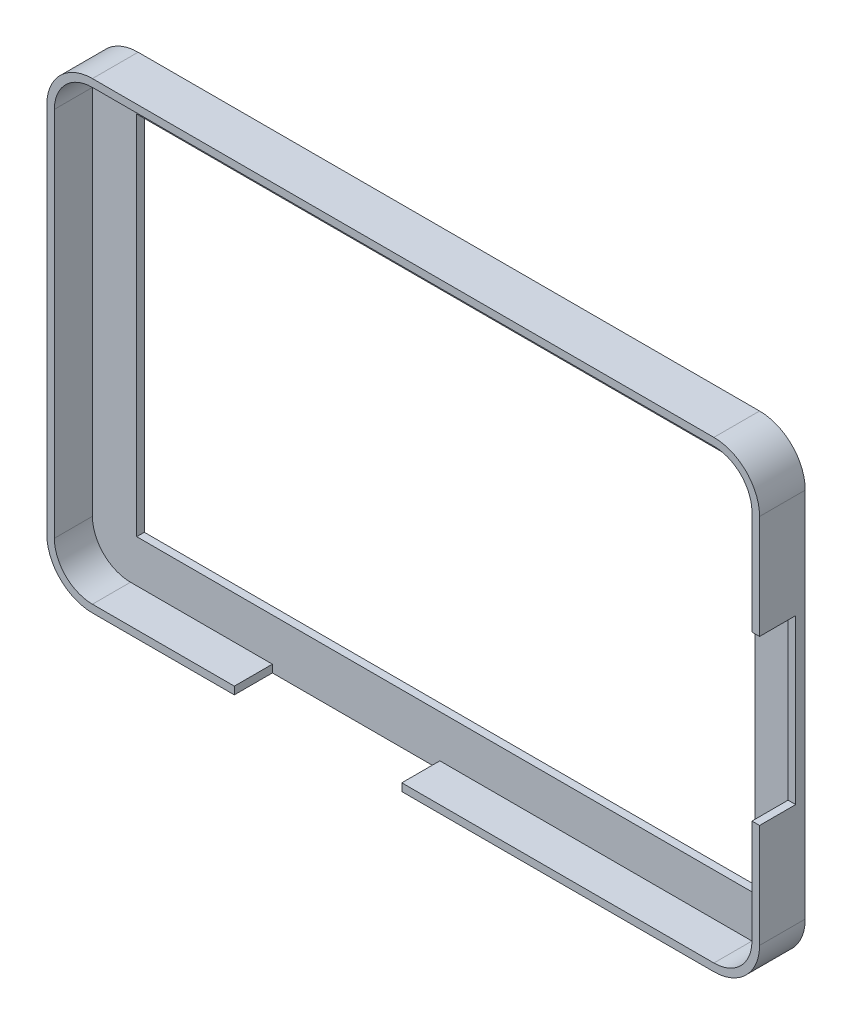
ISO-10303-21;
HEADER;
FILE_DESCRIPTION(('STEP AP214'),'2;1');
FILE_NAME('part.step','',(''),(''),'','','');
FILE_SCHEMA(('AUTOMOTIVE_DESIGN { 1 0 10303 214 1 1 1 1 }'));
ENDSEC;
DATA;
#1=APPLICATION_CONTEXT('core data for automotive mechanical design processes');
#2=APPLICATION_PROTOCOL_DEFINITION('international standard','automotive_design',2000,#1);
#3=PRODUCT_CONTEXT('',#1,'mechanical');
#4=PRODUCT('Part','Part','',(#3));
#5=PRODUCT_RELATED_PRODUCT_CATEGORY('part','',(#4));
#6=PRODUCT_DEFINITION_FORMATION('','',#4);
#7=PRODUCT_DEFINITION_CONTEXT('part definition',#1,'design');
#8=PRODUCT_DEFINITION('design','',#6,#7);
#9=PRODUCT_DEFINITION_SHAPE('','',#8);
#10=(LENGTH_UNIT() NAMED_UNIT(*) SI_UNIT(.MILLI.,.METRE.));
#11=(NAMED_UNIT(*) PLANE_ANGLE_UNIT() SI_UNIT($,.RADIAN.));
#12=(NAMED_UNIT(*) SI_UNIT($,.STERADIAN.) SOLID_ANGLE_UNIT());
#13=UNCERTAINTY_MEASURE_WITH_UNIT(LENGTH_MEASURE(1.E-05),#10,'distance_accuracy_value','');
#14=(GEOMETRIC_REPRESENTATION_CONTEXT(3) GLOBAL_UNCERTAINTY_ASSIGNED_CONTEXT((#13)) GLOBAL_UNIT_ASSIGNED_CONTEXT((#10,
#11,#12)) REPRESENTATION_CONTEXT('',''));
#15=CARTESIAN_POINT('',(0.,0.,0.));
#16=DIRECTION('',(0.,0.,1.));
#17=DIRECTION('',(1.,0.,0.));
#18=AXIS2_PLACEMENT_3D('',#15,#16,#17);
#19=CARTESIAN_POINT('',(46.82,-30.4,6.));
#20=DIRECTION('',(0.,1.,0.));
#21=DIRECTION('',(0.,0.,1.));
#22=AXIS2_PLACEMENT_3D('',#19,#20,#21);
#23=PLANE('',#22);
#24=DIRECTION('',(0.,0.,1.));
#25=VECTOR('',#24,1.);
#26=CARTESIAN_POINT('',(-0.18,-30.4,6.));
#27=LINE('',#26,#25);
#28=CARTESIAN_POINT('',(-0.18,-30.4,1.));
#29=VERTEX_POINT('',#28);
#30=CARTESIAN_POINT('',(-0.18,-30.4,6.));
#31=VERTEX_POINT('',#30);
#32=EDGE_CURVE('E247',#29,#31,#27,.T.);
#33=ORIENTED_EDGE('',*,*,#32,.F.);
#34=DIRECTION('',(1.,0.,0.));
#35=VECTOR('',#34,1.);
#36=CARTESIAN_POINT('',(-0.18,-30.4,1.));
#37=LINE('',#36,#35);
#38=CARTESIAN_POINT('',(-22.18,-30.4,0.999999999999997));
#39=VERTEX_POINT('',#38);
#40=EDGE_CURVE('E260',#39,#29,#37,.T.);
#41=ORIENTED_EDGE('',*,*,#40,.F.);
#42=DIRECTION('',(0.,0.,-1.));
#43=VECTOR('',#42,1.);
#44=CARTESIAN_POINT('',(-22.18,-30.4,6.));
#45=LINE('',#44,#43);
#46=CARTESIAN_POINT('',(-22.18,-30.4,6.));
#47=VERTEX_POINT('',#46);
#48=EDGE_CURVE('E255',#47,#39,#45,.T.);
#49=ORIENTED_EDGE('',*,*,#48,.F.);
#50=DIRECTION('',(1.,0.,0.));
#51=VECTOR('',#50,1.);
#52=CARTESIAN_POINT('',(46.82,-30.4,6.));
#53=LINE('',#52,#51);
#54=CARTESIAN_POINT('',(-40.82,-30.4,6.));
#55=VERTEX_POINT('',#54);
#56=EDGE_CURVE('E362',#55,#47,#53,.T.);
#57=ORIENTED_EDGE('',*,*,#56,.F.);
#58=DIRECTION('',(0.,0.,-1.));
#59=VECTOR('',#58,1.);
#60=CARTESIAN_POINT('',(-40.82,-30.4,6.));
#61=LINE('',#60,#59);
#62=CARTESIAN_POINT('',(-40.82,-30.4,0.));
#63=VERTEX_POINT('',#62);
#64=EDGE_CURVE('E394',#55,#63,#61,.T.);
#65=ORIENTED_EDGE('',*,*,#64,.T.);
#66=DIRECTION('',(1.,0.,0.));
#67=VECTOR('',#66,1.);
#68=CARTESIAN_POINT('',(46.82,-30.4,0.));
#69=LINE('',#68,#67);
#70=CARTESIAN_POINT('',(40.82,-30.4,0.));
#71=VERTEX_POINT('',#70);
#72=EDGE_CURVE('E374',#63,#71,#69,.T.);
#73=ORIENTED_EDGE('',*,*,#72,.T.);
#74=DIRECTION('',(0.,0.,-1.));
#75=VECTOR('',#74,1.);
#76=CARTESIAN_POINT('',(40.82,-30.4,6.));
#77=LINE('',#76,#75);
#78=CARTESIAN_POINT('',(40.82,-30.4,6.));
#79=VERTEX_POINT('',#78);
#80=EDGE_CURVE('E399',#71,#79,#77,.F.);
#81=ORIENTED_EDGE('',*,*,#80,.T.);
#82=EDGE_CURVE('E363',#31,#79,#53,.T.);
#83=ORIENTED_EDGE('',*,*,#82,.F.);
#84=EDGE_LOOP('',(#33,#41,#49,#57,#65,#73,#81,#83));
#85=FACE_BOUND('',#84,.T.);
#86=ADVANCED_FACE('F39',(#85),#23,.F.);
#87=CARTESIAN_POINT('',(0.,0.,6.));
#88=DIRECTION('',(0.,0.,-1.));
#89=DIRECTION('',(-1.,0.,0.));
#90=AXIS2_PLACEMENT_3D('',#87,#88,#89);
#91=PLANE('',#90);
#92=DIRECTION('',(0.,-1.,0.));
#93=VECTOR('',#92,1.);
#94=CARTESIAN_POINT('',(-22.18,-24.4,6.));
#95=LINE('',#94,#93);
#96=CARTESIAN_POINT('',(-22.18,-29.4,6.));
#97=VERTEX_POINT('',#96);
#98=EDGE_CURVE('E266',#97,#47,#95,.T.);
#99=ORIENTED_EDGE('',*,*,#98,.F.);
#100=DIRECTION('',(1.,0.,0.));
#101=VECTOR('',#100,1.);
#102=CARTESIAN_POINT('',(0.,-29.4,6.));
#103=LINE('',#102,#101);
#104=CARTESIAN_POINT('',(-40.82,-29.4,6.));
#105=VERTEX_POINT('',#104);
#106=EDGE_CURVE('E347',#105,#97,#103,.T.);
#107=ORIENTED_EDGE('',*,*,#106,.F.);
#108=CARTESIAN_POINT('',(-40.82,-24.4,6.));
#109=DIRECTION('',(0.,0.,-1.));
#110=DIRECTION('',(-1.,0.,0.));
#111=AXIS2_PLACEMENT_3D('',#108,#109,#110);
#112=CIRCLE('',#111,5.);
#113=CARTESIAN_POINT('',(-45.82,-24.4,6.));
#114=VERTEX_POINT('',#113);
#115=EDGE_CURVE('E341',#114,#105,#112,.F.);
#116=ORIENTED_EDGE('',*,*,#115,.F.);
#117=DIRECTION('',(0.,-1.,0.));
#118=VECTOR('',#117,1.);
#119=CARTESIAN_POINT('',(-45.82,0.,6.));
#120=LINE('',#119,#118);
#121=CARTESIAN_POINT('',(-45.82,24.4,6.));
#122=VERTEX_POINT('',#121);
#123=EDGE_CURVE('E338',#122,#114,#120,.T.);
#124=ORIENTED_EDGE('',*,*,#123,.F.);
#125=CARTESIAN_POINT('',(-40.82,24.4,6.));
#126=DIRECTION('',(0.,0.,-1.));
#127=DIRECTION('',(-1.,0.,0.));
#128=AXIS2_PLACEMENT_3D('',#125,#126,#127);
#129=CIRCLE('',#128,5.);
#130=CARTESIAN_POINT('',(-40.82,29.4,6.));
#131=VERTEX_POINT('',#130);
#132=EDGE_CURVE('E340',#131,#122,#129,.F.);
#133=ORIENTED_EDGE('',*,*,#132,.F.);
#134=DIRECTION('',(-1.,0.,0.));
#135=VECTOR('',#134,1.);
#136=CARTESIAN_POINT('',(0.,29.4,6.));
#137=LINE('',#136,#135);
#138=CARTESIAN_POINT('',(40.82,29.4,6.));
#139=VERTEX_POINT('',#138);
#140=EDGE_CURVE('E304',#139,#131,#137,.T.);
#141=ORIENTED_EDGE('',*,*,#140,.F.);
#142=CARTESIAN_POINT('',(40.82,24.4,6.));
#143=DIRECTION('',(0.,0.,-1.));
#144=DIRECTION('',(-1.,0.,0.));
#145=AXIS2_PLACEMENT_3D('',#142,#143,#144);
#146=CIRCLE('',#145,5.);
#147=CARTESIAN_POINT('',(45.82,24.4,6.));
#148=VERTEX_POINT('',#147);
#149=EDGE_CURVE('E329',#148,#139,#146,.F.);
#150=ORIENTED_EDGE('',*,*,#149,.F.);
#151=DIRECTION('',(0.,1.,0.));
#152=VECTOR('',#151,1.);
#153=CARTESIAN_POINT('',(45.82,0.,6.));
#154=LINE('',#153,#152);
#155=CARTESIAN_POINT('',(45.82,10.75,6.));
#156=VERTEX_POINT('',#155);
#157=EDGE_CURVE('E349',#156,#148,#154,.T.);
#158=ORIENTED_EDGE('',*,*,#157,.F.);
#159=DIRECTION('',(1.,0.,0.));
#160=VECTOR('',#159,1.);
#161=CARTESIAN_POINT('',(0.,10.75,6.));
#162=LINE('',#161,#160);
#163=CARTESIAN_POINT('',(46.82,10.75,6.));
#164=VERTEX_POINT('',#163);
#165=EDGE_CURVE('E283',#156,#164,#162,.T.);
#166=ORIENTED_EDGE('',*,*,#165,.T.);
#167=DIRECTION('',(0.,1.,0.));
#168=VECTOR('',#167,1.);
#169=CARTESIAN_POINT('',(46.82,-30.4,6.));
#170=LINE('',#169,#168);
#171=CARTESIAN_POINT('',(46.82,24.4,6.));
#172=VERTEX_POINT('',#171);
#173=EDGE_CURVE('E364',#164,#172,#170,.T.);
#174=ORIENTED_EDGE('',*,*,#173,.T.);
#175=CARTESIAN_POINT('',(40.82,24.4,6.));
#176=DIRECTION('',(0.,0.,-1.));
#177=DIRECTION('',(-1.,0.,0.));
#178=AXIS2_PLACEMENT_3D('',#175,#176,#177);
#179=CIRCLE('',#178,6.);
#180=CARTESIAN_POINT('',(40.82,30.4,6.));
#181=VERTEX_POINT('',#180);
#182=EDGE_CURVE('E398',#172,#181,#179,.F.);
#183=ORIENTED_EDGE('',*,*,#182,.T.);
#184=DIRECTION('',(-1.,0.,0.));
#185=VECTOR('',#184,1.);
#186=CARTESIAN_POINT('',(46.82,30.4,6.));
#187=LINE('',#186,#185);
#188=CARTESIAN_POINT('',(-40.82,30.4,6.));
#189=VERTEX_POINT('',#188);
#190=EDGE_CURVE('E353',#181,#189,#187,.T.);
#191=ORIENTED_EDGE('',*,*,#190,.T.);
#192=CARTESIAN_POINT('',(-40.82,24.4,6.));
#193=DIRECTION('',(0.,0.,-1.));
#194=DIRECTION('',(-1.,0.,0.));
#195=AXIS2_PLACEMENT_3D('',#192,#193,#194);
#196=CIRCLE('',#195,6.);
#197=CARTESIAN_POINT('',(-46.82,24.4,6.));
#198=VERTEX_POINT('',#197);
#199=EDGE_CURVE('E402',#189,#198,#196,.F.);
#200=ORIENTED_EDGE('',*,*,#199,.T.);
#201=DIRECTION('',(0.,-1.,0.));
#202=VECTOR('',#201,1.);
#203=CARTESIAN_POINT('',(-46.82,-30.4,6.));
#204=LINE('',#203,#202);
#205=CARTESIAN_POINT('',(-46.82,-24.4,6.));
#206=VERTEX_POINT('',#205);
#207=EDGE_CURVE('E356',#198,#206,#204,.T.);
#208=ORIENTED_EDGE('',*,*,#207,.T.);
#209=CARTESIAN_POINT('',(-40.82,-24.4,6.));
#210=DIRECTION('',(0.,0.,-1.));
#211=DIRECTION('',(-1.,0.,0.));
#212=AXIS2_PLACEMENT_3D('',#209,#210,#211);
#213=CIRCLE('',#212,6.);
#214=EDGE_CURVE('E401',#206,#55,#213,.F.);
#215=ORIENTED_EDGE('',*,*,#214,.T.);
#216=ORIENTED_EDGE('',*,*,#56,.T.);
#217=EDGE_LOOP('',(#99,#107,#116,#124,#133,#141,#150,#158,#166,#174,#183,#191,#200,#208,#215,#216));
#218=FACE_BOUND('',#217,.T.);
#219=ADVANCED_FACE('F451',(#218),#91,.F.);
#220=CARTESIAN_POINT('',(46.82,-29.4,6.));
#221=DIRECTION('',(0.,1.,0.));
#222=DIRECTION('',(0.,0.,1.));
#223=AXIS2_PLACEMENT_3D('',#220,#221,#222);
#224=PLANE('',#223);
#225=DIRECTION('',(0.,0.,-1.));
#226=VECTOR('',#225,1.);
#227=CARTESIAN_POINT('',(-0.18,-29.4,6.));
#228=LINE('',#227,#226);
#229=CARTESIAN_POINT('',(-0.18,-29.4,6.));
#230=VERTEX_POINT('',#229);
#231=CARTESIAN_POINT('',(-0.18,-29.4,1.));
#232=VERTEX_POINT('',#231);
#233=EDGE_CURVE('E426',#230,#232,#228,.T.);
#234=ORIENTED_EDGE('',*,*,#233,.F.);
#235=CARTESIAN_POINT('',(40.82,-29.4,6.));
#236=VERTEX_POINT('',#235);
#237=EDGE_CURVE('E343',#230,#236,#103,.T.);
#238=ORIENTED_EDGE('',*,*,#237,.T.);
#239=DIRECTION('',(0.,0.,1.));
#240=VECTOR('',#239,1.);
#241=CARTESIAN_POINT('',(40.82,-29.4,6.));
#242=LINE('',#241,#240);
#243=CARTESIAN_POINT('',(40.82,-29.4,1.));
#244=VERTEX_POINT('',#243);
#245=EDGE_CURVE('E330',#244,#236,#242,.T.);
#246=ORIENTED_EDGE('',*,*,#245,.F.);
#247=DIRECTION('',(1.,0.,0.));
#248=VECTOR('',#247,1.);
#249=CARTESIAN_POINT('',(0.,-29.4,1.));
#250=LINE('',#249,#248);
#251=EDGE_CURVE('E309',#232,#244,#250,.T.);
#252=ORIENTED_EDGE('',*,*,#251,.F.);
#253=EDGE_LOOP('',(#234,#238,#246,#252));
#254=FACE_BOUND('',#253,.T.);
#255=ADVANCED_FACE('F459',(#254),#224,.T.);
#256=CARTESIAN_POINT('',(46.82,-30.4,6.));
#257=DIRECTION('',(-1.,0.,0.));
#258=DIRECTION('',(0.,0.,1.));
#259=AXIS2_PLACEMENT_3D('',#256,#257,#258);
#260=PLANE('',#259);
#261=DIRECTION('',(0.,0.,1.));
#262=VECTOR('',#261,1.);
#263=CARTESIAN_POINT('',(46.82,10.75,10.75));
#264=LINE('',#263,#262);
#265=CARTESIAN_POINT('',(46.82,10.75,1.25));
#266=VERTEX_POINT('',#265);
#267=EDGE_CURVE('E263',#266,#164,#264,.T.);
#268=ORIENTED_EDGE('',*,*,#267,.F.);
#269=DIRECTION('',(0.,1.,0.));
#270=VECTOR('',#269,1.);
#271=CARTESIAN_POINT('',(46.82,-10.75,1.25));
#272=LINE('',#271,#270);
#273=CARTESIAN_POINT('',(46.82,-10.75,1.25));
#274=VERTEX_POINT('',#273);
#275=EDGE_CURVE('E273',#274,#266,#272,.T.);
#276=ORIENTED_EDGE('',*,*,#275,.F.);
#277=DIRECTION('',(0.,0.,-1.));
#278=VECTOR('',#277,1.);
#279=CARTESIAN_POINT('',(46.82,-10.75,10.75));
#280=LINE('',#279,#278);
#281=CARTESIAN_POINT('',(46.82,-10.75,6.));
#282=VERTEX_POINT('',#281);
#283=EDGE_CURVE('E271',#282,#274,#280,.T.);
#284=ORIENTED_EDGE('',*,*,#283,.F.);
#285=CARTESIAN_POINT('',(46.82,-24.4,6.));
#286=VERTEX_POINT('',#285);
#287=EDGE_CURVE('E368',#286,#282,#170,.T.);
#288=ORIENTED_EDGE('',*,*,#287,.F.);
#289=DIRECTION('',(0.,0.,-1.));
#290=VECTOR('',#289,1.);
#291=CARTESIAN_POINT('',(46.82,-24.4,6.));
#292=LINE('',#291,#290);
#293=CARTESIAN_POINT('',(46.82,-24.4,0.));
#294=VERTEX_POINT('',#293);
#295=EDGE_CURVE('E385',#286,#294,#292,.T.);
#296=ORIENTED_EDGE('',*,*,#295,.T.);
#297=DIRECTION('',(0.,1.,0.));
#298=VECTOR('',#297,1.);
#299=CARTESIAN_POINT('',(46.82,-30.4,0.));
#300=LINE('',#299,#298);
#301=CARTESIAN_POINT('',(46.82,24.4,0.));
#302=VERTEX_POINT('',#301);
#303=EDGE_CURVE('E360',#294,#302,#300,.T.);
#304=ORIENTED_EDGE('',*,*,#303,.T.);
#305=DIRECTION('',(0.,0.,-1.));
#306=VECTOR('',#305,1.);
#307=CARTESIAN_POINT('',(46.82,24.4,6.));
#308=LINE('',#307,#306);
#309=EDGE_CURVE('E369',#302,#172,#308,.F.);
#310=ORIENTED_EDGE('',*,*,#309,.T.);
#311=ORIENTED_EDGE('',*,*,#173,.F.);
#312=EDGE_LOOP('',(#268,#276,#284,#288,#296,#304,#310,#311));
#313=FACE_BOUND('',#312,.T.);
#314=ADVANCED_FACE('F469',(#313),#260,.F.);
#315=CARTESIAN_POINT('',(46.82,30.4,6.));
#316=DIRECTION('',(0.,-1.,0.));
#317=DIRECTION('',(0.,0.,-1.));
#318=AXIS2_PLACEMENT_3D('',#315,#316,#317);
#319=PLANE('',#318);
#320=DIRECTION('',(-1.,0.,0.));
#321=VECTOR('',#320,1.);
#322=CARTESIAN_POINT('',(46.82,30.4,0.));
#323=LINE('',#322,#321);
#324=CARTESIAN_POINT('',(40.82,30.4,0.));
#325=VERTEX_POINT('',#324);
#326=CARTESIAN_POINT('',(-40.82,30.4,0.));
#327=VERTEX_POINT('',#326);
#328=EDGE_CURVE('E291',#325,#327,#323,.T.);
#329=ORIENTED_EDGE('',*,*,#328,.T.);
#330=DIRECTION('',(0.,0.,-1.));
#331=VECTOR('',#330,1.);
#332=CARTESIAN_POINT('',(-40.82,30.4,6.));
#333=LINE('',#332,#331);
#334=EDGE_CURVE('E412',#327,#189,#333,.F.);
#335=ORIENTED_EDGE('',*,*,#334,.T.);
#336=ORIENTED_EDGE('',*,*,#190,.F.);
#337=DIRECTION('',(0.,0.,-1.));
#338=VECTOR('',#337,1.);
#339=CARTESIAN_POINT('',(40.82,30.4,6.));
#340=LINE('',#339,#338);
#341=EDGE_CURVE('E411',#181,#325,#340,.T.);
#342=ORIENTED_EDGE('',*,*,#341,.T.);
#343=EDGE_LOOP('',(#329,#335,#336,#342));
#344=FACE_BOUND('',#343,.T.);
#345=ADVANCED_FACE('F473',(#344),#319,.F.);
#346=CARTESIAN_POINT('',(-46.82,-30.4,6.));
#347=DIRECTION('',(1.,0.,0.));
#348=DIRECTION('',(0.,0.,-1.));
#349=AXIS2_PLACEMENT_3D('',#346,#347,#348);
#350=PLANE('',#349);
#351=DIRECTION('',(0.,-1.,0.));
#352=VECTOR('',#351,1.);
#353=CARTESIAN_POINT('',(-46.82,-30.4,0.));
#354=LINE('',#353,#352);
#355=CARTESIAN_POINT('',(-46.82,24.4,0.));
#356=VERTEX_POINT('',#355);
#357=CARTESIAN_POINT('',(-46.82,-24.4,0.));
#358=VERTEX_POINT('',#357);
#359=EDGE_CURVE('E375',#356,#358,#354,.T.);
#360=ORIENTED_EDGE('',*,*,#359,.T.);
#361=DIRECTION('',(0.,0.,-1.));
#362=VECTOR('',#361,1.);
#363=CARTESIAN_POINT('',(-46.82,-24.4,6.));
#364=LINE('',#363,#362);
#365=EDGE_CURVE('E410',#358,#206,#364,.F.);
#366=ORIENTED_EDGE('',*,*,#365,.T.);
#367=ORIENTED_EDGE('',*,*,#207,.F.);
#368=DIRECTION('',(0.,0.,-1.));
#369=VECTOR('',#368,1.);
#370=CARTESIAN_POINT('',(-46.82,24.4,6.));
#371=LINE('',#370,#369);
#372=EDGE_CURVE('E407',#198,#356,#371,.T.);
#373=ORIENTED_EDGE('',*,*,#372,.T.);
#374=EDGE_LOOP('',(#360,#366,#367,#373));
#375=FACE_BOUND('',#374,.T.);
#376=ADVANCED_FACE('F470',(#375),#350,.F.);
#377=ORIENTED_EDGE('',*,*,#237,.F.);
#378=DIRECTION('',(0.,-1.,0.));
#379=VECTOR('',#378,1.);
#380=CARTESIAN_POINT('',(-0.18,-24.4,6.));
#381=LINE('',#380,#379);
#382=EDGE_CURVE('E257',#230,#31,#381,.T.);
#383=ORIENTED_EDGE('',*,*,#382,.T.);
#384=ORIENTED_EDGE('',*,*,#82,.T.);
#385=CARTESIAN_POINT('',(40.82,-24.4,6.));
#386=DIRECTION('',(0.,0.,-1.));
#387=DIRECTION('',(-1.,0.,0.));
#388=AXIS2_PLACEMENT_3D('',#385,#386,#387);
#389=CIRCLE('',#388,6.);
#390=EDGE_CURVE('E403',#79,#286,#389,.F.);
#391=ORIENTED_EDGE('',*,*,#390,.T.);
#392=ORIENTED_EDGE('',*,*,#287,.T.);
#393=DIRECTION('',(-1.,0.,0.));
#394=VECTOR('',#393,1.);
#395=CARTESIAN_POINT('',(0.,-10.75,6.));
#396=LINE('',#395,#394);
#397=CARTESIAN_POINT('',(45.82,-10.75,6.));
#398=VERTEX_POINT('',#397);
#399=EDGE_CURVE('E278',#282,#398,#396,.T.);
#400=ORIENTED_EDGE('',*,*,#399,.T.);
#401=CARTESIAN_POINT('',(45.82,-24.4,6.));
#402=VERTEX_POINT('',#401);
#403=EDGE_CURVE('E336',#402,#398,#154,.T.);
#404=ORIENTED_EDGE('',*,*,#403,.F.);
#405=CARTESIAN_POINT('',(40.82,-24.4,6.));
#406=DIRECTION('',(0.,0.,-1.));
#407=DIRECTION('',(-1.,0.,0.));
#408=AXIS2_PLACEMENT_3D('',#405,#406,#407);
#409=CIRCLE('',#408,5.);
#410=EDGE_CURVE('E322',#236,#402,#409,.F.);
#411=ORIENTED_EDGE('',*,*,#410,.F.);
#412=EDGE_LOOP('',(#377,#383,#384,#391,#392,#400,#404,#411));
#413=FACE_BOUND('',#412,.T.);
#414=ADVANCED_FACE('F462',(#413),#91,.F.);
#415=CARTESIAN_POINT('',(0.,0.,0.));
#416=DIRECTION('',(0.,0.,-1.));
#417=DIRECTION('',(-1.,0.,0.));
#418=AXIS2_PLACEMENT_3D('',#415,#416,#417);
#419=PLANE('',#418);
#420=DIRECTION('',(0.,1.,0.));
#421=VECTOR('',#420,1.);
#422=CARTESIAN_POINT('',(-40.0035200534595,-23.8079576976516,0.));
#423=LINE('',#422,#421);
#424=CARTESIAN_POINT('',(-40.0035200534595,-23.8079576976516,0.));
#425=VERTEX_POINT('',#424);
#426=CARTESIAN_POINT('',(-40.0035200534595,24.2769704066037,0.));
#427=VERTEX_POINT('',#426);
#428=EDGE_CURVE('E53',#425,#427,#423,.T.);
#429=ORIENTED_EDGE('',*,*,#428,.F.);
#430=DIRECTION('',(-1.,0.,0.));
#431=VECTOR('',#430,1.);
#432=CARTESIAN_POINT('',(-40.0035200534595,-23.8079576976516,0.));
#433=LINE('',#432,#431);
#434=CARTESIAN_POINT('',(41.2522942831432,-23.8079576976516,0.));
#435=VERTEX_POINT('',#434);
#436=EDGE_CURVE('E244',#435,#425,#433,.T.);
#437=ORIENTED_EDGE('',*,*,#436,.F.);
#438=DIRECTION('',(0.,-1.,0.));
#439=VECTOR('',#438,1.);
#440=CARTESIAN_POINT('',(41.2522942831432,-23.8079576976516,0.));
#441=LINE('',#440,#439);
#442=CARTESIAN_POINT('',(41.2522942831432,24.2769704066037,0.));
#443=VERTEX_POINT('',#442);
#444=EDGE_CURVE('E227',#443,#435,#441,.T.);
#445=ORIENTED_EDGE('',*,*,#444,.F.);
#446=DIRECTION('',(1.,0.,0.));
#447=VECTOR('',#446,1.);
#448=CARTESIAN_POINT('',(-40.0035200534595,24.2769704066037,0.));
#449=LINE('',#448,#447);
#450=EDGE_CURVE('E237',#427,#443,#449,.T.);
#451=ORIENTED_EDGE('',*,*,#450,.F.);
#452=EDGE_LOOP('',(#429,#437,#445,#451));
#453=FACE_BOUND('',#452,.T.);
#454=ORIENTED_EDGE('',*,*,#303,.F.);
#455=CARTESIAN_POINT('',(40.82,-24.4,0.));
#456=DIRECTION('',(0.,0.,-1.));
#457=DIRECTION('',(-1.,0.,0.));
#458=AXIS2_PLACEMENT_3D('',#455,#456,#457);
#459=CIRCLE('',#458,6.);
#460=EDGE_CURVE('E391',#294,#71,#459,.T.);
#461=ORIENTED_EDGE('',*,*,#460,.T.);
#462=ORIENTED_EDGE('',*,*,#72,.F.);
#463=CARTESIAN_POINT('',(-40.82,-24.4,0.));
#464=DIRECTION('',(0.,0.,-1.));
#465=DIRECTION('',(-1.,0.,0.));
#466=AXIS2_PLACEMENT_3D('',#463,#464,#465);
#467=CIRCLE('',#466,6.);
#468=EDGE_CURVE('E386',#63,#358,#467,.T.);
#469=ORIENTED_EDGE('',*,*,#468,.T.);
#470=ORIENTED_EDGE('',*,*,#359,.F.);
#471=CARTESIAN_POINT('',(-40.82,24.4,0.));
#472=DIRECTION('',(0.,0.,-1.));
#473=DIRECTION('',(-1.,0.,0.));
#474=AXIS2_PLACEMENT_3D('',#471,#472,#473);
#475=CIRCLE('',#474,6.);
#476=EDGE_CURVE('E390',#356,#327,#475,.T.);
#477=ORIENTED_EDGE('',*,*,#476,.T.);
#478=ORIENTED_EDGE('',*,*,#328,.F.);
#479=CARTESIAN_POINT('',(40.82,24.4,0.));
#480=DIRECTION('',(0.,0.,-1.));
#481=DIRECTION('',(-1.,0.,0.));
#482=AXIS2_PLACEMENT_3D('',#479,#480,#481);
#483=CIRCLE('',#482,6.);
#484=EDGE_CURVE('E384',#325,#302,#483,.T.);
#485=ORIENTED_EDGE('',*,*,#484,.T.);
#486=EDGE_LOOP('',(#454,#461,#462,#469,#470,#477,#478,#485));
#487=FACE_BOUND('',#486,.T.);
#488=ADVANCED_FACE('F238',(#453,#487),#419,.T.);
#489=CARTESIAN_POINT('',(40.82,-24.4,6.));
#490=DIRECTION('',(0.,0.,-1.));
#491=DIRECTION('',(-1.,0.,0.));
#492=AXIS2_PLACEMENT_3D('',#489,#490,#491);
#493=CYLINDRICAL_SURFACE('',#492,6.);
#494=ORIENTED_EDGE('',*,*,#390,.F.);
#495=ORIENTED_EDGE('',*,*,#80,.F.);
#496=ORIENTED_EDGE('',*,*,#460,.F.);
#497=ORIENTED_EDGE('',*,*,#295,.F.);
#498=EDGE_LOOP('',(#494,#495,#496,#497));
#499=FACE_BOUND('',#498,.T.);
#500=ADVANCED_FACE('F478',(#499),#493,.T.);
#501=CARTESIAN_POINT('',(-40.82,-24.4,6.));
#502=DIRECTION('',(0.,0.,-1.));
#503=DIRECTION('',(-1.,0.,0.));
#504=AXIS2_PLACEMENT_3D('',#501,#502,#503);
#505=CYLINDRICAL_SURFACE('',#504,6.);
#506=ORIENTED_EDGE('',*,*,#214,.F.);
#507=ORIENTED_EDGE('',*,*,#365,.F.);
#508=ORIENTED_EDGE('',*,*,#468,.F.);
#509=ORIENTED_EDGE('',*,*,#64,.F.);
#510=EDGE_LOOP('',(#506,#507,#508,#509));
#511=FACE_BOUND('',#510,.T.);
#512=ADVANCED_FACE('F479',(#511),#505,.T.);
#513=CARTESIAN_POINT('',(-40.82,24.4,6.));
#514=DIRECTION('',(0.,0.,-1.));
#515=DIRECTION('',(-1.,0.,0.));
#516=AXIS2_PLACEMENT_3D('',#513,#514,#515);
#517=CYLINDRICAL_SURFACE('',#516,6.);
#518=ORIENTED_EDGE('',*,*,#199,.F.);
#519=ORIENTED_EDGE('',*,*,#334,.F.);
#520=ORIENTED_EDGE('',*,*,#476,.F.);
#521=ORIENTED_EDGE('',*,*,#372,.F.);
#522=EDGE_LOOP('',(#518,#519,#520,#521));
#523=FACE_BOUND('',#522,.T.);
#524=ADVANCED_FACE('F485',(#523),#517,.T.);
#525=CARTESIAN_POINT('',(40.82,24.4,6.));
#526=DIRECTION('',(0.,0.,-1.));
#527=DIRECTION('',(-1.,0.,0.));
#528=AXIS2_PLACEMENT_3D('',#525,#526,#527);
#529=CYLINDRICAL_SURFACE('',#528,6.);
#530=ORIENTED_EDGE('',*,*,#182,.F.);
#531=ORIENTED_EDGE('',*,*,#309,.F.);
#532=ORIENTED_EDGE('',*,*,#484,.F.);
#533=ORIENTED_EDGE('',*,*,#341,.F.);
#534=EDGE_LOOP('',(#530,#531,#532,#533));
#535=FACE_BOUND('',#534,.T.);
#536=ADVANCED_FACE('F41',(#535),#529,.T.);
#537=CARTESIAN_POINT('',(46.82,29.4,6.));
#538=DIRECTION('',(0.,-1.,0.));
#539=DIRECTION('',(0.,0.,-1.));
#540=AXIS2_PLACEMENT_3D('',#537,#538,#539);
#541=PLANE('',#540);
#542=DIRECTION('',(-1.,0.,0.));
#543=VECTOR('',#542,1.);
#544=CARTESIAN_POINT('',(0.,29.4,1.));
#545=LINE('',#544,#543);
#546=CARTESIAN_POINT('',(40.82,29.4,1.));
#547=VERTEX_POINT('',#546);
#548=CARTESIAN_POINT('',(-40.82,29.4,1.));
#549=VERTEX_POINT('',#548);
#550=EDGE_CURVE('E286',#547,#549,#545,.T.);
#551=ORIENTED_EDGE('',*,*,#550,.F.);
#552=DIRECTION('',(0.,0.,-1.));
#553=VECTOR('',#552,1.);
#554=CARTESIAN_POINT('',(40.82,29.4,6.));
#555=LINE('',#554,#553);
#556=EDGE_CURVE('E294',#139,#547,#555,.T.);
#557=ORIENTED_EDGE('',*,*,#556,.F.);
#558=ORIENTED_EDGE('',*,*,#140,.T.);
#559=DIRECTION('',(0.,0.,-1.));
#560=VECTOR('',#559,1.);
#561=CARTESIAN_POINT('',(-40.82,29.4,6.));
#562=LINE('',#561,#560);
#563=EDGE_CURVE('E292',#549,#131,#562,.F.);
#564=ORIENTED_EDGE('',*,*,#563,.F.);
#565=EDGE_LOOP('',(#551,#557,#558,#564));
#566=FACE_BOUND('',#565,.T.);
#567=ADVANCED_FACE('F487',(#566),#541,.T.);
#568=CARTESIAN_POINT('',(-45.82,-30.4,6.));
#569=DIRECTION('',(1.,0.,0.));
#570=DIRECTION('',(0.,0.,-1.));
#571=AXIS2_PLACEMENT_3D('',#568,#569,#570);
#572=PLANE('',#571);
#573=DIRECTION('',(0.,-1.,0.));
#574=VECTOR('',#573,1.);
#575=CARTESIAN_POINT('',(-45.82,0.,1.));
#576=LINE('',#575,#574);
#577=CARTESIAN_POINT('',(-45.82,24.4,1.));
#578=VERTEX_POINT('',#577);
#579=CARTESIAN_POINT('',(-45.82,-24.4,1.));
#580=VERTEX_POINT('',#579);
#581=EDGE_CURVE('E287',#578,#580,#576,.T.);
#582=ORIENTED_EDGE('',*,*,#581,.F.);
#583=DIRECTION('',(0.,0.,-1.));
#584=VECTOR('',#583,1.);
#585=CARTESIAN_POINT('',(-45.82,24.4,6.));
#586=LINE('',#585,#584);
#587=EDGE_CURVE('E321',#122,#578,#586,.T.);
#588=ORIENTED_EDGE('',*,*,#587,.F.);
#589=ORIENTED_EDGE('',*,*,#123,.T.);
#590=DIRECTION('',(0.,0.,-1.));
#591=VECTOR('',#590,1.);
#592=CARTESIAN_POINT('',(-45.82,-24.4,6.));
#593=LINE('',#592,#591);
#594=EDGE_CURVE('E297',#580,#114,#593,.F.);
#595=ORIENTED_EDGE('',*,*,#594,.F.);
#596=EDGE_LOOP('',(#582,#588,#589,#595));
#597=FACE_BOUND('',#596,.T.);
#598=ADVANCED_FACE('F524',(#597),#572,.T.);
#599=DIRECTION('',(0.,0.,1.));
#600=VECTOR('',#599,1.);
#601=CARTESIAN_POINT('',(-22.18,-29.4,6.));
#602=LINE('',#601,#600);
#603=CARTESIAN_POINT('',(-22.18,-29.4,1.));
#604=VERTEX_POINT('',#603);
#605=EDGE_CURVE('E424',#604,#97,#602,.T.);
#606=ORIENTED_EDGE('',*,*,#605,.F.);
#607=CARTESIAN_POINT('',(-40.82,-29.4,1.));
#608=VERTEX_POINT('',#607);
#609=EDGE_CURVE('E301',#608,#604,#250,.T.);
#610=ORIENTED_EDGE('',*,*,#609,.F.);
#611=DIRECTION('',(0.,0.,1.));
#612=VECTOR('',#611,1.);
#613=CARTESIAN_POINT('',(-40.82,-29.4,6.));
#614=LINE('',#613,#612);
#615=EDGE_CURVE('E308',#105,#608,#614,.F.);
#616=ORIENTED_EDGE('',*,*,#615,.F.);
#617=ORIENTED_EDGE('',*,*,#106,.T.);
#618=EDGE_LOOP('',(#606,#610,#616,#617));
#619=FACE_BOUND('',#618,.T.);
#620=ADVANCED_FACE('F507',(#619),#224,.T.);
#621=CARTESIAN_POINT('',(45.82,-30.4,6.));
#622=DIRECTION('',(-1.,0.,0.));
#623=DIRECTION('',(0.,0.,1.));
#624=AXIS2_PLACEMENT_3D('',#621,#622,#623);
#625=PLANE('',#624);
#626=DIRECTION('',(0.,0.,-1.));
#627=VECTOR('',#626,1.);
#628=CARTESIAN_POINT('',(45.82,10.75,6.00000000000001));
#629=LINE('',#628,#627);
#630=CARTESIAN_POINT('',(45.82,10.75,1.25));
#631=VERTEX_POINT('',#630);
#632=EDGE_CURVE('E425',#156,#631,#629,.T.);
#633=ORIENTED_EDGE('',*,*,#632,.F.);
#634=ORIENTED_EDGE('',*,*,#157,.T.);
#635=DIRECTION('',(0.,0.,1.));
#636=VECTOR('',#635,1.);
#637=CARTESIAN_POINT('',(45.82,24.4,6.));
#638=LINE('',#637,#636);
#639=CARTESIAN_POINT('',(45.82,24.4,1.));
#640=VERTEX_POINT('',#639);
#641=EDGE_CURVE('E334',#640,#148,#638,.T.);
#642=ORIENTED_EDGE('',*,*,#641,.F.);
#643=DIRECTION('',(0.,1.,0.));
#644=VECTOR('',#643,1.);
#645=CARTESIAN_POINT('',(45.82,0.,1.));
#646=LINE('',#645,#644);
#647=CARTESIAN_POINT('',(45.82,-24.4,1.));
#648=VERTEX_POINT('',#647);
#649=EDGE_CURVE('E299',#648,#640,#646,.T.);
#650=ORIENTED_EDGE('',*,*,#649,.F.);
#651=DIRECTION('',(0.,0.,1.));
#652=VECTOR('',#651,1.);
#653=CARTESIAN_POINT('',(45.82,-24.4,6.));
#654=LINE('',#653,#652);
#655=EDGE_CURVE('E318',#402,#648,#654,.F.);
#656=ORIENTED_EDGE('',*,*,#655,.F.);
#657=ORIENTED_EDGE('',*,*,#403,.T.);
#658=DIRECTION('',(0.,0.,1.));
#659=VECTOR('',#658,1.);
#660=CARTESIAN_POINT('',(45.82,-10.75,6.));
#661=LINE('',#660,#659);
#662=CARTESIAN_POINT('',(45.82,-10.75,1.25));
#663=VERTEX_POINT('',#662);
#664=EDGE_CURVE('E417',#663,#398,#661,.T.);
#665=ORIENTED_EDGE('',*,*,#664,.F.);
#666=DIRECTION('',(0.,-1.,0.));
#667=VECTOR('',#666,1.);
#668=CARTESIAN_POINT('',(45.82,-30.4,1.25));
#669=LINE('',#668,#667);
#670=EDGE_CURVE('E420',#631,#663,#669,.T.);
#671=ORIENTED_EDGE('',*,*,#670,.F.);
#672=EDGE_LOOP('',(#633,#634,#642,#650,#656,#657,#665,#671));
#673=FACE_BOUND('',#672,.T.);
#674=ADVANCED_FACE('F536',(#673),#625,.T.);
#675=CARTESIAN_POINT('',(0.,0.,1.));
#676=DIRECTION('',(0.,0.,-1.));
#677=DIRECTION('',(-1.,0.,0.));
#678=AXIS2_PLACEMENT_3D('',#675,#676,#677);
#679=PLANE('',#678);
#680=DIRECTION('',(-1.,0.,0.));
#681=VECTOR('',#680,1.);
#682=CARTESIAN_POINT('',(0.,-23.8079576976516,1.));
#683=LINE('',#682,#681);
#684=CARTESIAN_POINT('',(41.2522942831432,-23.8079576976516,1.));
#685=VERTEX_POINT('',#684);
#686=CARTESIAN_POINT('',(-40.0035200534595,-23.8079576976516,1.));
#687=VERTEX_POINT('',#686);
#688=EDGE_CURVE('E50',#685,#687,#683,.T.);
#689=ORIENTED_EDGE('',*,*,#688,.T.);
#690=DIRECTION('',(0.,1.,0.));
#691=VECTOR('',#690,1.);
#692=CARTESIAN_POINT('',(-40.0035200534595,0.,1.));
#693=LINE('',#692,#691);
#694=CARTESIAN_POINT('',(-40.0035200534595,24.2769704066037,1.));
#695=VERTEX_POINT('',#694);
#696=EDGE_CURVE('E11',#687,#695,#693,.T.);
#697=ORIENTED_EDGE('',*,*,#696,.T.);
#698=DIRECTION('',(1.,0.,0.));
#699=VECTOR('',#698,1.);
#700=CARTESIAN_POINT('',(0.,24.2769704066037,1.));
#701=LINE('',#700,#699);
#702=CARTESIAN_POINT('',(41.2522942831432,24.2769704066037,1.));
#703=VERTEX_POINT('',#702);
#704=EDGE_CURVE('E428',#695,#703,#701,.T.);
#705=ORIENTED_EDGE('',*,*,#704,.T.);
#706=DIRECTION('',(0.,-1.,0.));
#707=VECTOR('',#706,1.);
#708=CARTESIAN_POINT('',(41.2522942831432,0.,1.));
#709=LINE('',#708,#707);
#710=EDGE_CURVE('E230',#703,#685,#709,.T.);
#711=ORIENTED_EDGE('',*,*,#710,.T.);
#712=EDGE_LOOP('',(#689,#697,#705,#711));
#713=FACE_BOUND('',#712,.T.);
#714=ORIENTED_EDGE('',*,*,#609,.T.);
#715=DIRECTION('',(0.,-1.,0.));
#716=VECTOR('',#715,1.);
#717=CARTESIAN_POINT('',(-22.18,-24.4,0.999999999999997));
#718=LINE('',#717,#716);
#719=EDGE_CURVE('E262',#604,#39,#718,.T.);
#720=ORIENTED_EDGE('',*,*,#719,.T.);
#721=ORIENTED_EDGE('',*,*,#40,.T.);
#722=DIRECTION('',(0.,-1.,0.));
#723=VECTOR('',#722,1.);
#724=CARTESIAN_POINT('',(-0.18,-24.4,1.));
#725=LINE('',#724,#723);
#726=EDGE_CURVE('E261',#232,#29,#725,.T.);
#727=ORIENTED_EDGE('',*,*,#726,.F.);
#728=ORIENTED_EDGE('',*,*,#251,.T.);
#729=CARTESIAN_POINT('',(40.82,-24.4,1.));
#730=DIRECTION('',(0.,0.,-1.));
#731=DIRECTION('',(-1.,0.,0.));
#732=AXIS2_PLACEMENT_3D('',#729,#730,#731);
#733=CIRCLE('',#732,5.);
#734=EDGE_CURVE('E305',#648,#244,#733,.T.);
#735=ORIENTED_EDGE('',*,*,#734,.F.);
#736=ORIENTED_EDGE('',*,*,#649,.T.);
#737=CARTESIAN_POINT('',(40.82,24.4,1.));
#738=DIRECTION('',(0.,0.,-1.));
#739=DIRECTION('',(-1.,0.,0.));
#740=AXIS2_PLACEMENT_3D('',#737,#738,#739);
#741=CIRCLE('',#740,5.);
#742=EDGE_CURVE('E316',#547,#640,#741,.T.);
#743=ORIENTED_EDGE('',*,*,#742,.F.);
#744=ORIENTED_EDGE('',*,*,#550,.T.);
#745=CARTESIAN_POINT('',(-40.82,24.4,1.));
#746=DIRECTION('',(0.,0.,-1.));
#747=DIRECTION('',(-1.,0.,0.));
#748=AXIS2_PLACEMENT_3D('',#745,#746,#747);
#749=CIRCLE('',#748,5.);
#750=EDGE_CURVE('E315',#578,#549,#749,.T.);
#751=ORIENTED_EDGE('',*,*,#750,.F.);
#752=ORIENTED_EDGE('',*,*,#581,.T.);
#753=CARTESIAN_POINT('',(-40.82,-24.4,1.));
#754=DIRECTION('',(0.,0.,-1.));
#755=DIRECTION('',(-1.,0.,0.));
#756=AXIS2_PLACEMENT_3D('',#753,#754,#755);
#757=CIRCLE('',#756,5.);
#758=EDGE_CURVE('E307',#608,#580,#757,.T.);
#759=ORIENTED_EDGE('',*,*,#758,.F.);
#760=EDGE_LOOP('',(#714,#720,#721,#727,#728,#735,#736,#743,#744,#751,#752,#759));
#761=FACE_BOUND('',#760,.T.);
#762=ADVANCED_FACE('F435',(#713,#761),#679,.F.);
#763=CARTESIAN_POINT('',(40.82,-24.4,6.));
#764=DIRECTION('',(0.,0.,-1.));
#765=DIRECTION('',(-1.,0.,0.));
#766=AXIS2_PLACEMENT_3D('',#763,#764,#765);
#767=CYLINDRICAL_SURFACE('',#766,5.);
#768=ORIENTED_EDGE('',*,*,#410,.T.);
#769=ORIENTED_EDGE('',*,*,#655,.T.);
#770=ORIENTED_EDGE('',*,*,#734,.T.);
#771=ORIENTED_EDGE('',*,*,#245,.T.);
#772=EDGE_LOOP('',(#768,#769,#770,#771));
#773=FACE_BOUND('',#772,.T.);
#774=ADVANCED_FACE('F570',(#773),#767,.F.);
#775=CARTESIAN_POINT('',(-40.82,-24.4,6.));
#776=DIRECTION('',(0.,0.,-1.));
#777=DIRECTION('',(-1.,0.,0.));
#778=AXIS2_PLACEMENT_3D('',#775,#776,#777);
#779=CYLINDRICAL_SURFACE('',#778,5.);
#780=ORIENTED_EDGE('',*,*,#115,.T.);
#781=ORIENTED_EDGE('',*,*,#615,.T.);
#782=ORIENTED_EDGE('',*,*,#758,.T.);
#783=ORIENTED_EDGE('',*,*,#594,.T.);
#784=EDGE_LOOP('',(#780,#781,#782,#783));
#785=FACE_BOUND('',#784,.T.);
#786=ADVANCED_FACE('F511',(#785),#779,.F.);
#787=CARTESIAN_POINT('',(-40.82,24.4,6.));
#788=DIRECTION('',(0.,0.,-1.));
#789=DIRECTION('',(-1.,0.,0.));
#790=AXIS2_PLACEMENT_3D('',#787,#788,#789);
#791=CYLINDRICAL_SURFACE('',#790,5.);
#792=ORIENTED_EDGE('',*,*,#132,.T.);
#793=ORIENTED_EDGE('',*,*,#587,.T.);
#794=ORIENTED_EDGE('',*,*,#750,.T.);
#795=ORIENTED_EDGE('',*,*,#563,.T.);
#796=EDGE_LOOP('',(#792,#793,#794,#795));
#797=FACE_BOUND('',#796,.T.);
#798=ADVANCED_FACE('F525',(#797),#791,.F.);
#799=CARTESIAN_POINT('',(40.82,24.4,6.));
#800=DIRECTION('',(0.,0.,-1.));
#801=DIRECTION('',(-1.,0.,0.));
#802=AXIS2_PLACEMENT_3D('',#799,#800,#801);
#803=CYLINDRICAL_SURFACE('',#802,5.);
#804=ORIENTED_EDGE('',*,*,#149,.T.);
#805=ORIENTED_EDGE('',*,*,#556,.T.);
#806=ORIENTED_EDGE('',*,*,#742,.T.);
#807=ORIENTED_EDGE('',*,*,#641,.T.);
#808=EDGE_LOOP('',(#804,#805,#806,#807));
#809=FACE_BOUND('',#808,.T.);
#810=ADVANCED_FACE('F533',(#809),#803,.F.);
#811=CARTESIAN_POINT('',(40.82,10.75,10.75));
#812=DIRECTION('',(0.,1.,0.));
#813=DIRECTION('',(0.,0.,1.));
#814=AXIS2_PLACEMENT_3D('',#811,#812,#813);
#815=PLANE('',#814);
#816=ORIENTED_EDGE('',*,*,#632,.T.);
#817=DIRECTION('',(1.,0.,0.));
#818=VECTOR('',#817,1.);
#819=CARTESIAN_POINT('',(40.82,10.75,1.25));
#820=LINE('',#819,#818);
#821=EDGE_CURVE('E279',#631,#266,#820,.T.);
#822=ORIENTED_EDGE('',*,*,#821,.T.);
#823=ORIENTED_EDGE('',*,*,#267,.T.);
#824=ORIENTED_EDGE('',*,*,#165,.F.);
#825=EDGE_LOOP('',(#816,#822,#823,#824));
#826=FACE_BOUND('',#825,.T.);
#827=ADVANCED_FACE('F545',(#826),#815,.F.);
#828=CARTESIAN_POINT('',(40.82,-10.75,10.75));
#829=DIRECTION('',(0.,-1.,0.));
#830=DIRECTION('',(0.,0.,-1.));
#831=AXIS2_PLACEMENT_3D('',#828,#829,#830);
#832=PLANE('',#831);
#833=ORIENTED_EDGE('',*,*,#283,.T.);
#834=DIRECTION('',(1.,0.,0.));
#835=VECTOR('',#834,1.);
#836=CARTESIAN_POINT('',(40.82,-10.75,1.25));
#837=LINE('',#836,#835);
#838=EDGE_CURVE('E280',#663,#274,#837,.T.);
#839=ORIENTED_EDGE('',*,*,#838,.F.);
#840=ORIENTED_EDGE('',*,*,#664,.T.);
#841=ORIENTED_EDGE('',*,*,#399,.F.);
#842=EDGE_LOOP('',(#833,#839,#840,#841));
#843=FACE_BOUND('',#842,.T.);
#844=ADVANCED_FACE('F565',(#843),#832,.F.);
#845=CARTESIAN_POINT('',(40.82,-10.75,1.25));
#846=DIRECTION('',(0.,0.,-1.));
#847=DIRECTION('',(-1.,0.,0.));
#848=AXIS2_PLACEMENT_3D('',#845,#846,#847);
#849=PLANE('',#848);
#850=ORIENTED_EDGE('',*,*,#670,.T.);
#851=ORIENTED_EDGE('',*,*,#838,.T.);
#852=ORIENTED_EDGE('',*,*,#275,.T.);
#853=ORIENTED_EDGE('',*,*,#821,.F.);
#854=EDGE_LOOP('',(#850,#851,#852,#853));
#855=FACE_BOUND('',#854,.T.);
#856=ADVANCED_FACE('F542',(#855),#849,.F.);
#857=CARTESIAN_POINT('',(-0.18,-24.4,6.));
#858=DIRECTION('',(1.,0.,0.));
#859=DIRECTION('',(0.,0.,-1.));
#860=AXIS2_PLACEMENT_3D('',#857,#858,#859);
#861=PLANE('',#860);
#862=ORIENTED_EDGE('',*,*,#233,.T.);
#863=ORIENTED_EDGE('',*,*,#726,.T.);
#864=ORIENTED_EDGE('',*,*,#32,.T.);
#865=ORIENTED_EDGE('',*,*,#382,.F.);
#866=EDGE_LOOP('',(#862,#863,#864,#865));
#867=FACE_BOUND('',#866,.T.);
#868=ADVANCED_FACE('F447',(#867),#861,.F.);
#869=CARTESIAN_POINT('',(-22.18,-24.4,6.));
#870=DIRECTION('',(-1.,0.,0.));
#871=DIRECTION('',(0.,0.,1.));
#872=AXIS2_PLACEMENT_3D('',#869,#870,#871);
#873=PLANE('',#872);
#874=ORIENTED_EDGE('',*,*,#605,.T.);
#875=ORIENTED_EDGE('',*,*,#98,.T.);
#876=ORIENTED_EDGE('',*,*,#48,.T.);
#877=ORIENTED_EDGE('',*,*,#719,.F.);
#878=EDGE_LOOP('',(#874,#875,#876,#877));
#879=FACE_BOUND('',#878,.T.);
#880=ADVANCED_FACE('F438',(#879),#873,.F.);
#881=CARTESIAN_POINT('',(-40.0035200534595,-23.8079576976516,6.));
#882=DIRECTION('',(-1.,0.,0.));
#883=DIRECTION('',(0.,0.,1.));
#884=AXIS2_PLACEMENT_3D('',#881,#882,#883);
#885=PLANE('',#884);
#886=DIRECTION('',(0.,0.,-1.));
#887=VECTOR('',#886,1.);
#888=CARTESIAN_POINT('',(-40.0035200534595,-23.8079576976516,6.));
#889=LINE('',#888,#887);
#890=EDGE_CURVE('E250',#687,#425,#889,.T.);
#891=ORIENTED_EDGE('',*,*,#890,.T.);
#892=ORIENTED_EDGE('',*,*,#428,.T.);
#893=DIRECTION('',(0.,0.,-1.));
#894=VECTOR('',#893,1.);
#895=CARTESIAN_POINT('',(-40.0035200534595,24.2769704066037,6.));
#896=LINE('',#895,#894);
#897=EDGE_CURVE('E235',#695,#427,#896,.T.);
#898=ORIENTED_EDGE('',*,*,#897,.F.);
#899=ORIENTED_EDGE('',*,*,#696,.F.);
#900=EDGE_LOOP('',(#891,#892,#898,#899));
#901=FACE_BOUND('',#900,.T.);
#902=ADVANCED_FACE('F440',(#901),#885,.F.);
#903=CARTESIAN_POINT('',(-40.0035200534595,-23.8079576976516,6.));
#904=DIRECTION('',(0.,-1.,0.));
#905=DIRECTION('',(0.,0.,-1.));
#906=AXIS2_PLACEMENT_3D('',#903,#904,#905);
#907=PLANE('',#906);
#908=DIRECTION('',(0.,0.,-1.));
#909=VECTOR('',#908,1.);
#910=CARTESIAN_POINT('',(41.2522942831432,-23.8079576976516,6.));
#911=LINE('',#910,#909);
#912=EDGE_CURVE('E231',#685,#435,#911,.T.);
#913=ORIENTED_EDGE('',*,*,#912,.T.);
#914=ORIENTED_EDGE('',*,*,#436,.T.);
#915=ORIENTED_EDGE('',*,*,#890,.F.);
#916=ORIENTED_EDGE('',*,*,#688,.F.);
#917=EDGE_LOOP('',(#913,#914,#915,#916));
#918=FACE_BOUND('',#917,.T.);
#919=ADVANCED_FACE('F436',(#918),#907,.F.);
#920=CARTESIAN_POINT('',(41.2522942831432,-23.8079576976516,6.));
#921=DIRECTION('',(1.,0.,0.));
#922=DIRECTION('',(0.,0.,-1.));
#923=AXIS2_PLACEMENT_3D('',#920,#921,#922);
#924=PLANE('',#923);
#925=DIRECTION('',(0.,0.,-1.));
#926=VECTOR('',#925,1.);
#927=CARTESIAN_POINT('',(41.2522942831432,24.2769704066037,6.));
#928=LINE('',#927,#926);
#929=EDGE_CURVE('E62',#703,#443,#928,.T.);
#930=ORIENTED_EDGE('',*,*,#929,.T.);
#931=ORIENTED_EDGE('',*,*,#444,.T.);
#932=ORIENTED_EDGE('',*,*,#912,.F.);
#933=ORIENTED_EDGE('',*,*,#710,.F.);
#934=EDGE_LOOP('',(#930,#931,#932,#933));
#935=FACE_BOUND('',#934,.T.);
#936=ADVANCED_FACE('F221',(#935),#924,.F.);
#937=CARTESIAN_POINT('',(-40.0035200534595,24.2769704066037,6.));
#938=DIRECTION('',(0.,1.,0.));
#939=DIRECTION('',(0.,0.,1.));
#940=AXIS2_PLACEMENT_3D('',#937,#938,#939);
#941=PLANE('',#940);
#942=ORIENTED_EDGE('',*,*,#897,.T.);
#943=ORIENTED_EDGE('',*,*,#450,.T.);
#944=ORIENTED_EDGE('',*,*,#929,.F.);
#945=ORIENTED_EDGE('',*,*,#704,.F.);
#946=EDGE_LOOP('',(#942,#943,#944,#945));
#947=FACE_BOUND('',#946,.T.);
#948=ADVANCED_FACE('F240',(#947),#941,.F.);
#949=CLOSED_SHELL('',(#86,#219,#255,#314,#345,#376,#414,#488,#500,#512,#524,#536,#567,#598,#620,
#674,#762,#774,#786,#798,#810,#827,#844,#856,#868,#880,#902,#919,#936,#948));
#950=MANIFOLD_SOLID_BREP('B2',#949);
#951=ADVANCED_BREP_SHAPE_REPRESENTATION('',(#18,#950),#14);
#952=SHAPE_DEFINITION_REPRESENTATION(#9,#951);
ENDSEC;
END-ISO-10303-21;
